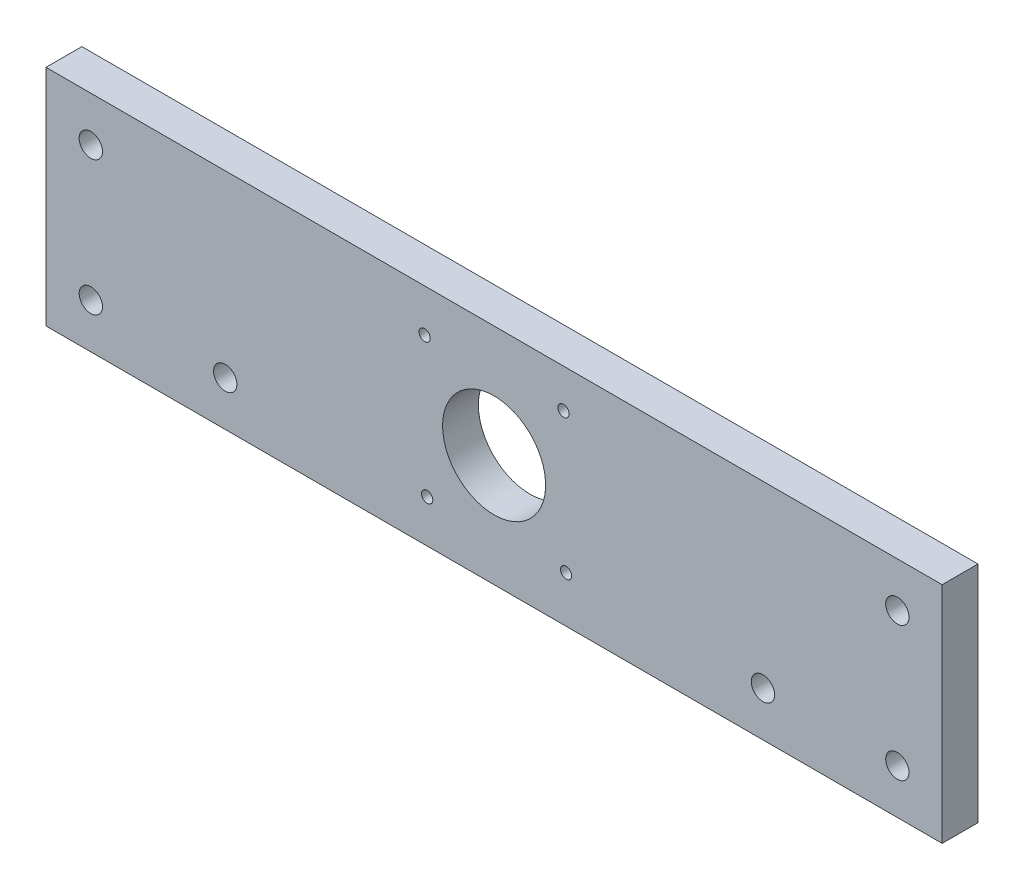
ISO-10303-21;
HEADER;
FILE_DESCRIPTION(('STEP AP214'),'2;1');
FILE_NAME('part.step','',(''),(''),'','','');
FILE_SCHEMA(('AUTOMOTIVE_DESIGN { 1 0 10303 214 1 1 1 1 }'));
ENDSEC;
DATA;
#1=APPLICATION_CONTEXT('core data for automotive mechanical design processes');
#2=APPLICATION_PROTOCOL_DEFINITION('international standard','automotive_design',2000,#1);
#3=PRODUCT_CONTEXT('',#1,'mechanical');
#4=PRODUCT('Part','Part','',(#3));
#5=PRODUCT_RELATED_PRODUCT_CATEGORY('part','',(#4));
#6=PRODUCT_DEFINITION_FORMATION('','',#4);
#7=PRODUCT_DEFINITION_CONTEXT('part definition',#1,'design');
#8=PRODUCT_DEFINITION('design','',#6,#7);
#9=PRODUCT_DEFINITION_SHAPE('','',#8);
#10=(LENGTH_UNIT() NAMED_UNIT(*) SI_UNIT(.MILLI.,.METRE.));
#11=(NAMED_UNIT(*) PLANE_ANGLE_UNIT() SI_UNIT($,.RADIAN.));
#12=(NAMED_UNIT(*) SI_UNIT($,.STERADIAN.) SOLID_ANGLE_UNIT());
#13=UNCERTAINTY_MEASURE_WITH_UNIT(LENGTH_MEASURE(1.E-05),#10,'distance_accuracy_value','');
#14=(GEOMETRIC_REPRESENTATION_CONTEXT(3) GLOBAL_UNCERTAINTY_ASSIGNED_CONTEXT((#13)) GLOBAL_UNIT_ASSIGNED_CONTEXT((#10,
#11,#12)) REPRESENTATION_CONTEXT('',''));
#15=CARTESIAN_POINT('',(0.,0.,0.));
#16=DIRECTION('',(0.,0.,1.));
#17=DIRECTION('',(1.,0.,0.));
#18=AXIS2_PLACEMENT_3D('',#15,#16,#17);
#19=CARTESIAN_POINT('',(-88.1445904954499,-0.815217391304357,8.));
#20=DIRECTION('',(0.,1.,0.));
#21=DIRECTION('',(0.,0.,1.));
#22=AXIS2_PLACEMENT_3D('',#19,#20,#21);
#23=PLANE('',#22);
#24=DIRECTION('',(1.,0.,0.));
#25=VECTOR('',#24,1.);
#26=CARTESIAN_POINT('',(-88.1445904954499,-0.815217391304357,0.));
#27=LINE('',#26,#25);
#28=CARTESIAN_POINT('',(-88.1445904954499,-0.815217391304357,0.));
#29=VERTEX_POINT('',#28);
#30=CARTESIAN_POINT('',(111.85540950455,-0.815217391304357,0.));
#31=VERTEX_POINT('',#30);
#32=EDGE_CURVE('E108',#29,#31,#27,.T.);
#33=ORIENTED_EDGE('',*,*,#32,.T.);
#34=DIRECTION('',(0.,0.,-1.));
#35=VECTOR('',#34,1.);
#36=CARTESIAN_POINT('',(111.85540950455,-0.815217391304357,8.));
#37=LINE('',#36,#35);
#38=CARTESIAN_POINT('',(111.85540950455,-0.815217391304357,8.));
#39=VERTEX_POINT('',#38);
#40=EDGE_CURVE('E11',#39,#31,#37,.T.);
#41=ORIENTED_EDGE('',*,*,#40,.F.);
#42=DIRECTION('',(1.,0.,0.));
#43=VECTOR('',#42,1.);
#44=CARTESIAN_POINT('',(-88.1445904954499,-0.815217391304357,8.));
#45=LINE('',#44,#43);
#46=CARTESIAN_POINT('',(-88.1445904954499,-0.815217391304357,8.));
#47=VERTEX_POINT('',#46);
#48=EDGE_CURVE('E80',#47,#39,#45,.T.);
#49=ORIENTED_EDGE('',*,*,#48,.F.);
#50=DIRECTION('',(0.,0.,-1.));
#51=VECTOR('',#50,1.);
#52=CARTESIAN_POINT('',(-88.1445904954499,-0.815217391304357,8.));
#53=LINE('',#52,#51);
#54=EDGE_CURVE('E104',#47,#29,#53,.T.);
#55=ORIENTED_EDGE('',*,*,#54,.T.);
#56=EDGE_LOOP('',(#33,#41,#49,#55));
#57=FACE_BOUND('',#56,.T.);
#58=ADVANCED_FACE('F38',(#57),#23,.F.);
#59=CARTESIAN_POINT('',(111.85540950455,49.1847826086956,8.));
#60=DIRECTION('',(1.,0.,0.));
#61=DIRECTION('',(0.,1.,0.));
#62=AXIS2_PLACEMENT_3D('',#59,#60,#61);
#63=PLANE('',#62);
#64=DIRECTION('',(0.,-1.,0.));
#65=VECTOR('',#64,1.);
#66=CARTESIAN_POINT('',(111.85540950455,49.1847826086956,0.));
#67=LINE('',#66,#65);
#68=CARTESIAN_POINT('',(111.85540950455,49.1847826086956,0.));
#69=VERTEX_POINT('',#68);
#70=EDGE_CURVE('E89',#69,#31,#67,.T.);
#71=ORIENTED_EDGE('',*,*,#70,.F.);
#72=DIRECTION('',(0.,0.,-1.));
#73=VECTOR('',#72,1.);
#74=CARTESIAN_POINT('',(111.85540950455,49.1847826086956,8.));
#75=LINE('',#74,#73);
#76=CARTESIAN_POINT('',(111.85540950455,49.1847826086956,8.));
#77=VERTEX_POINT('',#76);
#78=EDGE_CURVE('E48',#77,#69,#75,.T.);
#79=ORIENTED_EDGE('',*,*,#78,.F.);
#80=DIRECTION('',(0.,-1.,0.));
#81=VECTOR('',#80,1.);
#82=CARTESIAN_POINT('',(111.85540950455,49.1847826086956,8.));
#83=LINE('',#82,#81);
#84=EDGE_CURVE('E87',#77,#39,#83,.T.);
#85=ORIENTED_EDGE('',*,*,#84,.T.);
#86=ORIENTED_EDGE('',*,*,#40,.T.);
#87=EDGE_LOOP('',(#71,#79,#85,#86));
#88=FACE_BOUND('',#87,.T.);
#89=ADVANCED_FACE('F86',(#88),#63,.T.);
#90=CARTESIAN_POINT('',(-88.1445904954499,49.1847826086956,8.));
#91=DIRECTION('',(0.,1.,0.));
#92=DIRECTION('',(0.,0.,1.));
#93=AXIS2_PLACEMENT_3D('',#90,#91,#92);
#94=PLANE('',#93);
#95=DIRECTION('',(1.,0.,0.));
#96=VECTOR('',#95,1.);
#97=CARTESIAN_POINT('',(-88.1445904954499,49.1847826086956,0.));
#98=LINE('',#97,#96);
#99=CARTESIAN_POINT('',(-88.1445904954499,49.1847826086956,0.));
#100=VERTEX_POINT('',#99);
#101=EDGE_CURVE('E115',#100,#69,#98,.T.);
#102=ORIENTED_EDGE('',*,*,#101,.F.);
#103=DIRECTION('',(0.,0.,-1.));
#104=VECTOR('',#103,1.);
#105=CARTESIAN_POINT('',(-88.1445904954499,49.1847826086956,8.));
#106=LINE('',#105,#104);
#107=CARTESIAN_POINT('',(-88.1445904954499,49.1847826086956,8.));
#108=VERTEX_POINT('',#107);
#109=EDGE_CURVE('E72',#108,#100,#106,.T.);
#110=ORIENTED_EDGE('',*,*,#109,.F.);
#111=DIRECTION('',(1.,0.,0.));
#112=VECTOR('',#111,1.);
#113=CARTESIAN_POINT('',(-88.1445904954499,49.1847826086956,8.));
#114=LINE('',#113,#112);
#115=EDGE_CURVE('E97',#108,#77,#114,.T.);
#116=ORIENTED_EDGE('',*,*,#115,.T.);
#117=ORIENTED_EDGE('',*,*,#78,.T.);
#118=EDGE_LOOP('',(#102,#110,#116,#117));
#119=FACE_BOUND('',#118,.T.);
#120=ADVANCED_FACE('F100',(#119),#94,.T.);
#121=CARTESIAN_POINT('',(-88.1445904954499,49.1847826086956,8.));
#122=DIRECTION('',(1.,0.,0.));
#123=DIRECTION('',(0.,0.,-1.));
#124=AXIS2_PLACEMENT_3D('',#121,#122,#123);
#125=PLANE('',#124);
#126=DIRECTION('',(0.,-1.,0.));
#127=VECTOR('',#126,1.);
#128=CARTESIAN_POINT('',(-88.1445904954499,49.1847826086956,0.));
#129=LINE('',#128,#127);
#130=EDGE_CURVE('E75',#100,#29,#129,.T.);
#131=ORIENTED_EDGE('',*,*,#130,.T.);
#132=ORIENTED_EDGE('',*,*,#54,.F.);
#133=DIRECTION('',(0.,-1.,0.));
#134=VECTOR('',#133,1.);
#135=CARTESIAN_POINT('',(-88.1445904954499,49.1847826086956,8.));
#136=LINE('',#135,#134);
#137=EDGE_CURVE('E57',#108,#47,#136,.T.);
#138=ORIENTED_EDGE('',*,*,#137,.F.);
#139=ORIENTED_EDGE('',*,*,#109,.T.);
#140=EDGE_LOOP('',(#131,#132,#138,#139));
#141=FACE_BOUND('',#140,.T.);
#142=ADVANCED_FACE('F207',(#141),#125,.F.);
#143=CARTESIAN_POINT('',(0.,0.,8.));
#144=DIRECTION('',(0.,0.,-1.));
#145=DIRECTION('',(-1.,0.,0.));
#146=AXIS2_PLACEMENT_3D('',#143,#144,#145);
#147=PLANE('',#146);
#148=CARTESIAN_POINT('',(71.8554095045501,9.18478260869565,8.));
#149=DIRECTION('',(0.,0.,-1.));
#150=DIRECTION('',(-1.,0.,0.));
#151=AXIS2_PLACEMENT_3D('',#148,#149,#150);
#152=CIRCLE('',#151,2.6);
#153=CARTESIAN_POINT('',(69.2554095045501,9.18478260869565,8.));
#154=VERTEX_POINT('',#153);
#155=EDGE_CURVE('E374',#154,#154,#152,.T.);
#156=ORIENTED_EDGE('',*,*,#155,.T.);
#157=EDGE_LOOP('',(#156));
#158=FACE_BOUND('',#157,.T.);
#159=CARTESIAN_POINT('',(-48.1445904954499,9.18478260869565,8.));
#160=DIRECTION('',(0.,0.,-1.));
#161=DIRECTION('',(-1.,0.,0.));
#162=AXIS2_PLACEMENT_3D('',#159,#160,#161);
#163=CIRCLE('',#162,2.59999999999999);
#164=CARTESIAN_POINT('',(-50.7445904954499,9.18478260869565,8.));
#165=VERTEX_POINT('',#164);
#166=EDGE_CURVE('E129',#165,#165,#163,.T.);
#167=ORIENTED_EDGE('',*,*,#166,.T.);
#168=EDGE_LOOP('',(#167));
#169=FACE_BOUND('',#168,.T.);
#170=CARTESIAN_POINT('',(11.8554095045501,24.1847826086956,8.));
#171=DIRECTION('',(0.,0.,-1.));
#172=DIRECTION('',(-1.,0.,0.));
#173=AXIS2_PLACEMENT_3D('',#170,#171,#172);
#174=CIRCLE('',#173,11.5);
#175=CARTESIAN_POINT('',(0.355409504550113,24.1847826086956,8.));
#176=VERTEX_POINT('',#175);
#177=EDGE_CURVE('E156',#176,#176,#174,.F.);
#178=ORIENTED_EDGE('',*,*,#177,.F.);
#179=EDGE_LOOP('',(#178));
#180=FACE_BOUND('',#179,.T.);
#181=CARTESIAN_POINT('',(27.3554095045501,40.5444654492686,8.));
#182=DIRECTION('',(0.,0.,-1.));
#183=DIRECTION('',(-1.,0.,0.));
#184=AXIS2_PLACEMENT_3D('',#181,#182,#183);
#185=CIRCLE('',#184,1.24999999999999);
#186=CARTESIAN_POINT('',(26.1054095045501,40.5444654492686,8.));
#187=VERTEX_POINT('',#186);
#188=EDGE_CURVE('E142',#187,#187,#185,.F.);
#189=ORIENTED_EDGE('',*,*,#188,.F.);
#190=EDGE_LOOP('',(#189));
#191=FACE_BOUND('',#190,.T.);
#192=CARTESIAN_POINT('',(27.9240946230703,9.54446544926862,8.));
#193=DIRECTION('',(0.,0.,-1.));
#194=DIRECTION('',(-1.,0.,0.));
#195=AXIS2_PLACEMENT_3D('',#192,#193,#194);
#196=CIRCLE('',#195,1.24999999999999);
#197=CARTESIAN_POINT('',(26.6740946230703,9.54446544926862,8.));
#198=VERTEX_POINT('',#197);
#199=EDGE_CURVE('E138',#198,#198,#196,.F.);
#200=ORIENTED_EDGE('',*,*,#199,.F.);
#201=EDGE_LOOP('',(#200));
#202=FACE_BOUND('',#201,.T.);
#203=CARTESIAN_POINT('',(-3.0759053769297,8.68478260869564,8.));
#204=DIRECTION('',(0.,0.,-1.));
#205=DIRECTION('',(-1.,0.,0.));
#206=AXIS2_PLACEMENT_3D('',#203,#204,#205);
#207=CIRCLE('',#206,1.24999999999999);
#208=CARTESIAN_POINT('',(-4.32590537692969,8.68478260869564,8.));
#209=VERTEX_POINT('',#208);
#210=EDGE_CURVE('E134',#209,#209,#207,.F.);
#211=ORIENTED_EDGE('',*,*,#210,.F.);
#212=EDGE_LOOP('',(#211));
#213=FACE_BOUND('',#212,.T.);
#214=CARTESIAN_POINT('',(-3.64459049544989,39.6847826086956,8.));
#215=DIRECTION('',(0.,0.,-1.));
#216=DIRECTION('',(-1.,0.,0.));
#217=AXIS2_PLACEMENT_3D('',#214,#215,#216);
#218=CIRCLE('',#217,1.25);
#219=CARTESIAN_POINT('',(-4.89459049544989,39.6847826086956,8.));
#220=VERTEX_POINT('',#219);
#221=EDGE_CURVE('E128',#220,#220,#218,.F.);
#222=ORIENTED_EDGE('',*,*,#221,.F.);
#223=EDGE_LOOP('',(#222));
#224=FACE_BOUND('',#223,.T.);
#225=CARTESIAN_POINT('',(101.85540950455,39.1847826086956,8.));
#226=DIRECTION('',(0.,0.,-1.));
#227=DIRECTION('',(-1.,0.,0.));
#228=AXIS2_PLACEMENT_3D('',#225,#226,#227);
#229=CIRCLE('',#228,2.6);
#230=CARTESIAN_POINT('',(99.2554095045501,39.1847826086956,8.));
#231=VERTEX_POINT('',#230);
#232=EDGE_CURVE('E164',#231,#231,#229,.T.);
#233=ORIENTED_EDGE('',*,*,#232,.T.);
#234=EDGE_LOOP('',(#233));
#235=FACE_BOUND('',#234,.T.);
#236=CARTESIAN_POINT('',(101.85540950455,9.18478260869565,8.));
#237=DIRECTION('',(0.,0.,-1.));
#238=DIRECTION('',(-1.,0.,0.));
#239=AXIS2_PLACEMENT_3D('',#236,#237,#238);
#240=CIRCLE('',#239,2.6);
#241=CARTESIAN_POINT('',(99.2554095045504,9.18478260869565,8.));
#242=VERTEX_POINT('',#241);
#243=EDGE_CURVE('E172',#242,#242,#240,.T.);
#244=ORIENTED_EDGE('',*,*,#243,.T.);
#245=EDGE_LOOP('',(#244));
#246=FACE_BOUND('',#245,.T.);
#247=CARTESIAN_POINT('',(-78.1445904954496,9.18478260869565,8.));
#248=DIRECTION('',(0.,0.,-1.));
#249=DIRECTION('',(-1.,0.,0.));
#250=AXIS2_PLACEMENT_3D('',#247,#248,#249);
#251=CIRCLE('',#250,2.6);
#252=CARTESIAN_POINT('',(-80.7445904954496,9.18478260869565,8.));
#253=VERTEX_POINT('',#252);
#254=EDGE_CURVE('E180',#253,#253,#251,.T.);
#255=ORIENTED_EDGE('',*,*,#254,.T.);
#256=EDGE_LOOP('',(#255));
#257=FACE_BOUND('',#256,.T.);
#258=CARTESIAN_POINT('',(-78.1445904954499,39.1847826086956,8.));
#259=DIRECTION('',(0.,0.,-1.));
#260=DIRECTION('',(-1.,0.,0.));
#261=AXIS2_PLACEMENT_3D('',#258,#259,#260);
#262=CIRCLE('',#261,2.6);
#263=CARTESIAN_POINT('',(-80.7445904954499,39.1847826086956,8.));
#264=VERTEX_POINT('',#263);
#265=EDGE_CURVE('E112',#264,#264,#262,.T.);
#266=ORIENTED_EDGE('',*,*,#265,.T.);
#267=EDGE_LOOP('',(#266));
#268=FACE_BOUND('',#267,.T.);
#269=ORIENTED_EDGE('',*,*,#48,.T.);
#270=ORIENTED_EDGE('',*,*,#84,.F.);
#271=ORIENTED_EDGE('',*,*,#115,.F.);
#272=ORIENTED_EDGE('',*,*,#137,.T.);
#273=EDGE_LOOP('',(#269,#270,#271,#272));
#274=FACE_BOUND('',#273,.T.);
#275=ADVANCED_FACE('F96',(#158,#169,#180,#191,#202,#213,#224,#235,#246,#257,#268,#274),#147,.F.);
#276=CARTESIAN_POINT('',(0.,0.,0.));
#277=DIRECTION('',(0.,0.,-1.));
#278=DIRECTION('',(-1.,0.,0.));
#279=AXIS2_PLACEMENT_3D('',#276,#277,#278);
#280=PLANE('',#279);
#281=CARTESIAN_POINT('',(71.8554095045501,9.18478260869565,0.));
#282=DIRECTION('',(0.,0.,-1.));
#283=DIRECTION('',(-1.,0.,0.));
#284=AXIS2_PLACEMENT_3D('',#281,#282,#283);
#285=CIRCLE('',#284,2.59999999999999);
#286=CARTESIAN_POINT('',(69.2554095045501,9.18478260869565,0.));
#287=VERTEX_POINT('',#286);
#288=EDGE_CURVE('E377',#287,#287,#285,.T.);
#289=ORIENTED_EDGE('',*,*,#288,.F.);
#290=EDGE_LOOP('',(#289));
#291=FACE_BOUND('',#290,.T.);
#292=CARTESIAN_POINT('',(-48.1445904954499,9.18478260869565,0.));
#293=DIRECTION('',(0.,0.,-1.));
#294=DIRECTION('',(-1.,0.,0.));
#295=AXIS2_PLACEMENT_3D('',#292,#293,#294);
#296=CIRCLE('',#295,2.59999999999998);
#297=CARTESIAN_POINT('',(-50.7445904954499,9.18478260869565,0.));
#298=VERTEX_POINT('',#297);
#299=EDGE_CURVE('E381',#298,#298,#296,.T.);
#300=ORIENTED_EDGE('',*,*,#299,.F.);
#301=EDGE_LOOP('',(#300));
#302=FACE_BOUND('',#301,.T.);
#303=CARTESIAN_POINT('',(11.8554095045501,24.1847826086956,0.));
#304=DIRECTION('',(0.,0.,-1.));
#305=DIRECTION('',(-1.,0.,0.));
#306=AXIS2_PLACEMENT_3D('',#303,#304,#305);
#307=CIRCLE('',#306,11.5);
#308=CARTESIAN_POINT('',(0.355409504550113,24.1847826086956,0.));
#309=VERTEX_POINT('',#308);
#310=EDGE_CURVE('E41',#309,#309,#307,.F.);
#311=ORIENTED_EDGE('',*,*,#310,.T.);
#312=EDGE_LOOP('',(#311));
#313=FACE_BOUND('',#312,.T.);
#314=CARTESIAN_POINT('',(27.3554095045501,40.5444654492686,0.));
#315=DIRECTION('',(0.,0.,-1.));
#316=DIRECTION('',(-1.,0.,0.));
#317=AXIS2_PLACEMENT_3D('',#314,#315,#316);
#318=CIRCLE('',#317,1.24999999999999);
#319=CARTESIAN_POINT('',(26.1054095045501,40.5444654492686,0.));
#320=VERTEX_POINT('',#319);
#321=EDGE_CURVE('E139',#320,#320,#318,.F.);
#322=ORIENTED_EDGE('',*,*,#321,.T.);
#323=EDGE_LOOP('',(#322));
#324=FACE_BOUND('',#323,.T.);
#325=CARTESIAN_POINT('',(27.9240946230703,9.54446544926862,0.));
#326=DIRECTION('',(0.,0.,-1.));
#327=DIRECTION('',(-1.,0.,0.));
#328=AXIS2_PLACEMENT_3D('',#325,#326,#327);
#329=CIRCLE('',#328,1.24999999999999);
#330=CARTESIAN_POINT('',(26.6740946230703,9.54446544926862,0.));
#331=VERTEX_POINT('',#330);
#332=EDGE_CURVE('E135',#331,#331,#329,.F.);
#333=ORIENTED_EDGE('',*,*,#332,.T.);
#334=EDGE_LOOP('',(#333));
#335=FACE_BOUND('',#334,.T.);
#336=CARTESIAN_POINT('',(-3.0759053769297,8.68478260869564,0.));
#337=DIRECTION('',(0.,0.,-1.));
#338=DIRECTION('',(-1.,0.,0.));
#339=AXIS2_PLACEMENT_3D('',#336,#337,#338);
#340=CIRCLE('',#339,1.24999999999999);
#341=CARTESIAN_POINT('',(-4.32590537692969,8.68478260869564,0.));
#342=VERTEX_POINT('',#341);
#343=EDGE_CURVE('E130',#342,#342,#340,.F.);
#344=ORIENTED_EDGE('',*,*,#343,.T.);
#345=EDGE_LOOP('',(#344));
#346=FACE_BOUND('',#345,.T.);
#347=CARTESIAN_POINT('',(-3.64459049544989,39.6847826086956,0.));
#348=DIRECTION('',(0.,0.,-1.));
#349=DIRECTION('',(-1.,0.,0.));
#350=AXIS2_PLACEMENT_3D('',#347,#348,#349);
#351=CIRCLE('',#350,1.25);
#352=CARTESIAN_POINT('',(-4.89459049544989,39.6847826086956,0.));
#353=VERTEX_POINT('',#352);
#354=EDGE_CURVE('E124',#353,#353,#351,.F.);
#355=ORIENTED_EDGE('',*,*,#354,.T.);
#356=EDGE_LOOP('',(#355));
#357=FACE_BOUND('',#356,.T.);
#358=CARTESIAN_POINT('',(101.85540950455,39.1847826086956,0.));
#359=DIRECTION('',(0.,0.,-1.));
#360=DIRECTION('',(-1.,0.,0.));
#361=AXIS2_PLACEMENT_3D('',#358,#359,#360);
#362=CIRCLE('',#361,2.59999999999999);
#363=CARTESIAN_POINT('',(99.2554095045501,39.1847826086956,0.));
#364=VERTEX_POINT('',#363);
#365=EDGE_CURVE('E160',#364,#364,#362,.T.);
#366=ORIENTED_EDGE('',*,*,#365,.F.);
#367=EDGE_LOOP('',(#366));
#368=FACE_BOUND('',#367,.T.);
#369=CARTESIAN_POINT('',(101.85540950455,9.18478260869565,0.));
#370=DIRECTION('',(0.,0.,-1.));
#371=DIRECTION('',(-1.,0.,0.));
#372=AXIS2_PLACEMENT_3D('',#369,#370,#371);
#373=CIRCLE('',#372,2.59999999999999);
#374=CARTESIAN_POINT('',(99.2554095045504,9.18478260869565,0.));
#375=VERTEX_POINT('',#374);
#376=EDGE_CURVE('E168',#375,#375,#373,.T.);
#377=ORIENTED_EDGE('',*,*,#376,.F.);
#378=EDGE_LOOP('',(#377));
#379=FACE_BOUND('',#378,.T.);
#380=CARTESIAN_POINT('',(-78.1445904954496,9.18478260869565,0.));
#381=DIRECTION('',(0.,0.,-1.));
#382=DIRECTION('',(-1.,0.,0.));
#383=AXIS2_PLACEMENT_3D('',#380,#381,#382);
#384=CIRCLE('',#383,2.59999999999999);
#385=CARTESIAN_POINT('',(-80.7445904954496,9.18478260869565,0.));
#386=VERTEX_POINT('',#385);
#387=EDGE_CURVE('E176',#386,#386,#384,.T.);
#388=ORIENTED_EDGE('',*,*,#387,.F.);
#389=EDGE_LOOP('',(#388));
#390=FACE_BOUND('',#389,.T.);
#391=CARTESIAN_POINT('',(-78.1445904954499,39.1847826086956,0.));
#392=DIRECTION('',(0.,0.,-1.));
#393=DIRECTION('',(-1.,0.,0.));
#394=AXIS2_PLACEMENT_3D('',#391,#392,#393);
#395=CIRCLE('',#394,2.59999999999999);
#396=CARTESIAN_POINT('',(-80.7445904954499,39.1847826086956,0.));
#397=VERTEX_POINT('',#396);
#398=EDGE_CURVE('E184',#397,#397,#395,.T.);
#399=ORIENTED_EDGE('',*,*,#398,.F.);
#400=EDGE_LOOP('',(#399));
#401=FACE_BOUND('',#400,.T.);
#402=ORIENTED_EDGE('',*,*,#32,.F.);
#403=ORIENTED_EDGE('',*,*,#130,.F.);
#404=ORIENTED_EDGE('',*,*,#101,.T.);
#405=ORIENTED_EDGE('',*,*,#70,.T.);
#406=EDGE_LOOP('',(#402,#403,#404,#405));
#407=FACE_BOUND('',#406,.T.);
#408=ADVANCED_FACE('F195',(#291,#302,#313,#324,#335,#346,#357,#368,#379,#390,#401,#407),#280,.T.);
#409=CARTESIAN_POINT('',(-78.1445904954499,39.1847826086956,0.));
#410=DIRECTION('',(0.,0.,-1.));
#411=DIRECTION('',(-1.,0.,0.));
#412=AXIS2_PLACEMENT_3D('',#409,#410,#411);
#413=CYLINDRICAL_SURFACE('',#412,2.6);
#414=ORIENTED_EDGE('',*,*,#265,.F.);
#415=EDGE_LOOP('',(#414));
#416=FACE_BOUND('',#415,.T.);
#417=ORIENTED_EDGE('',*,*,#398,.T.);
#418=EDGE_LOOP('',(#417));
#419=FACE_BOUND('',#418,.T.);
#420=ADVANCED_FACE('F227',(#416,#419),#413,.F.);
#421=CARTESIAN_POINT('',(-78.1445904954496,9.18478260869565,0.));
#422=DIRECTION('',(0.,0.,-1.));
#423=DIRECTION('',(-1.,0.,0.));
#424=AXIS2_PLACEMENT_3D('',#421,#422,#423);
#425=CYLINDRICAL_SURFACE('',#424,2.6);
#426=ORIENTED_EDGE('',*,*,#254,.F.);
#427=EDGE_LOOP('',(#426));
#428=FACE_BOUND('',#427,.T.);
#429=ORIENTED_EDGE('',*,*,#387,.T.);
#430=EDGE_LOOP('',(#429));
#431=FACE_BOUND('',#430,.T.);
#432=ADVANCED_FACE('F230',(#428,#431),#425,.F.);
#433=CARTESIAN_POINT('',(101.85540950455,9.18478260869565,0.));
#434=DIRECTION('',(0.,0.,-1.));
#435=DIRECTION('',(-1.,0.,0.));
#436=AXIS2_PLACEMENT_3D('',#433,#434,#435);
#437=CYLINDRICAL_SURFACE('',#436,2.6);
#438=ORIENTED_EDGE('',*,*,#243,.F.);
#439=EDGE_LOOP('',(#438));
#440=FACE_BOUND('',#439,.T.);
#441=ORIENTED_EDGE('',*,*,#376,.T.);
#442=EDGE_LOOP('',(#441));
#443=FACE_BOUND('',#442,.T.);
#444=ADVANCED_FACE('F279',(#440,#443),#437,.F.);
#445=CARTESIAN_POINT('',(101.85540950455,39.1847826086956,0.));
#446=DIRECTION('',(0.,0.,-1.));
#447=DIRECTION('',(-1.,0.,0.));
#448=AXIS2_PLACEMENT_3D('',#445,#446,#447);
#449=CYLINDRICAL_SURFACE('',#448,2.6);
#450=ORIENTED_EDGE('',*,*,#232,.F.);
#451=EDGE_LOOP('',(#450));
#452=FACE_BOUND('',#451,.T.);
#453=ORIENTED_EDGE('',*,*,#365,.T.);
#454=EDGE_LOOP('',(#453));
#455=FACE_BOUND('',#454,.T.);
#456=ADVANCED_FACE('F289',(#452,#455),#449,.F.);
#457=CARTESIAN_POINT('',(-3.64459049544989,39.6847826086956,-10.));
#458=DIRECTION('',(0.,0.,1.));
#459=DIRECTION('',(1.,0.,0.));
#460=AXIS2_PLACEMENT_3D('',#457,#458,#459);
#461=CYLINDRICAL_SURFACE('',#460,1.25);
#462=ORIENTED_EDGE('',*,*,#354,.F.);
#463=EDGE_LOOP('',(#462));
#464=FACE_BOUND('',#463,.T.);
#465=ORIENTED_EDGE('',*,*,#221,.T.);
#466=EDGE_LOOP('',(#465));
#467=FACE_BOUND('',#466,.T.);
#468=ADVANCED_FACE('F299',(#464,#467),#461,.F.);
#469=CARTESIAN_POINT('',(-3.0759053769297,8.68478260869564,-10.));
#470=DIRECTION('',(0.,0.,1.));
#471=DIRECTION('',(1.,0.,0.));
#472=AXIS2_PLACEMENT_3D('',#469,#470,#471);
#473=CYLINDRICAL_SURFACE('',#472,1.24999999999999);
#474=ORIENTED_EDGE('',*,*,#343,.F.);
#475=EDGE_LOOP('',(#474));
#476=FACE_BOUND('',#475,.T.);
#477=ORIENTED_EDGE('',*,*,#210,.T.);
#478=EDGE_LOOP('',(#477));
#479=FACE_BOUND('',#478,.T.);
#480=ADVANCED_FACE('F309',(#476,#479),#473,.F.);
#481=CARTESIAN_POINT('',(27.9240946230703,9.54446544926862,-10.));
#482=DIRECTION('',(0.,0.,1.));
#483=DIRECTION('',(1.,0.,0.));
#484=AXIS2_PLACEMENT_3D('',#481,#482,#483);
#485=CYLINDRICAL_SURFACE('',#484,1.24999999999999);
#486=ORIENTED_EDGE('',*,*,#332,.F.);
#487=EDGE_LOOP('',(#486));
#488=FACE_BOUND('',#487,.T.);
#489=ORIENTED_EDGE('',*,*,#199,.T.);
#490=EDGE_LOOP('',(#489));
#491=FACE_BOUND('',#490,.T.);
#492=ADVANCED_FACE('F319',(#488,#491),#485,.F.);
#493=CARTESIAN_POINT('',(27.3554095045501,40.5444654492686,-10.));
#494=DIRECTION('',(0.,0.,1.));
#495=DIRECTION('',(1.,0.,0.));
#496=AXIS2_PLACEMENT_3D('',#493,#494,#495);
#497=CYLINDRICAL_SURFACE('',#496,1.24999999999999);
#498=ORIENTED_EDGE('',*,*,#321,.F.);
#499=EDGE_LOOP('',(#498));
#500=FACE_BOUND('',#499,.T.);
#501=ORIENTED_EDGE('',*,*,#188,.T.);
#502=EDGE_LOOP('',(#501));
#503=FACE_BOUND('',#502,.T.);
#504=ADVANCED_FACE('F201',(#500,#503),#497,.F.);
#505=CARTESIAN_POINT('',(11.8554095045501,24.1847826086956,-10.));
#506=DIRECTION('',(0.,0.,1.));
#507=DIRECTION('',(1.,0.,0.));
#508=AXIS2_PLACEMENT_3D('',#505,#506,#507);
#509=CYLINDRICAL_SURFACE('',#508,11.5);
#510=ORIENTED_EDGE('',*,*,#310,.F.);
#511=EDGE_LOOP('',(#510));
#512=FACE_BOUND('',#511,.T.);
#513=ORIENTED_EDGE('',*,*,#177,.T.);
#514=EDGE_LOOP('',(#513));
#515=FACE_BOUND('',#514,.T.);
#516=ADVANCED_FACE('F197',(#512,#515),#509,.F.);
#517=CARTESIAN_POINT('',(-48.1445904954499,9.18478260869565,0.));
#518=DIRECTION('',(0.,0.,-1.));
#519=DIRECTION('',(-1.,0.,0.));
#520=AXIS2_PLACEMENT_3D('',#517,#518,#519);
#521=CYLINDRICAL_SURFACE('',#520,2.59999999999999);
#522=ORIENTED_EDGE('',*,*,#166,.F.);
#523=EDGE_LOOP('',(#522));
#524=FACE_BOUND('',#523,.T.);
#525=ORIENTED_EDGE('',*,*,#299,.T.);
#526=EDGE_LOOP('',(#525));
#527=FACE_BOUND('',#526,.T.);
#528=ADVANCED_FACE('F200',(#524,#527),#521,.F.);
#529=CARTESIAN_POINT('',(71.8554095045501,9.18478260869565,0.));
#530=DIRECTION('',(0.,0.,-1.));
#531=DIRECTION('',(-1.,0.,0.));
#532=AXIS2_PLACEMENT_3D('',#529,#530,#531);
#533=CYLINDRICAL_SURFACE('',#532,2.6);
#534=ORIENTED_EDGE('',*,*,#155,.F.);
#535=EDGE_LOOP('',(#534));
#536=FACE_BOUND('',#535,.T.);
#537=ORIENTED_EDGE('',*,*,#288,.T.);
#538=EDGE_LOOP('',(#537));
#539=FACE_BOUND('',#538,.T.);
#540=ADVANCED_FACE('F357',(#536,#539),#533,.F.);
#541=CLOSED_SHELL('',(#58,#89,#120,#142,#275,#408,#420,#432,#444,#456,#468,#480,#492,#504,#516,
#528,#540));
#542=MANIFOLD_SOLID_BREP('B2',#541);
#543=ADVANCED_BREP_SHAPE_REPRESENTATION('',(#18,#542),#14);
#544=SHAPE_DEFINITION_REPRESENTATION(#9,#543);
ENDSEC;
END-ISO-10303-21;
